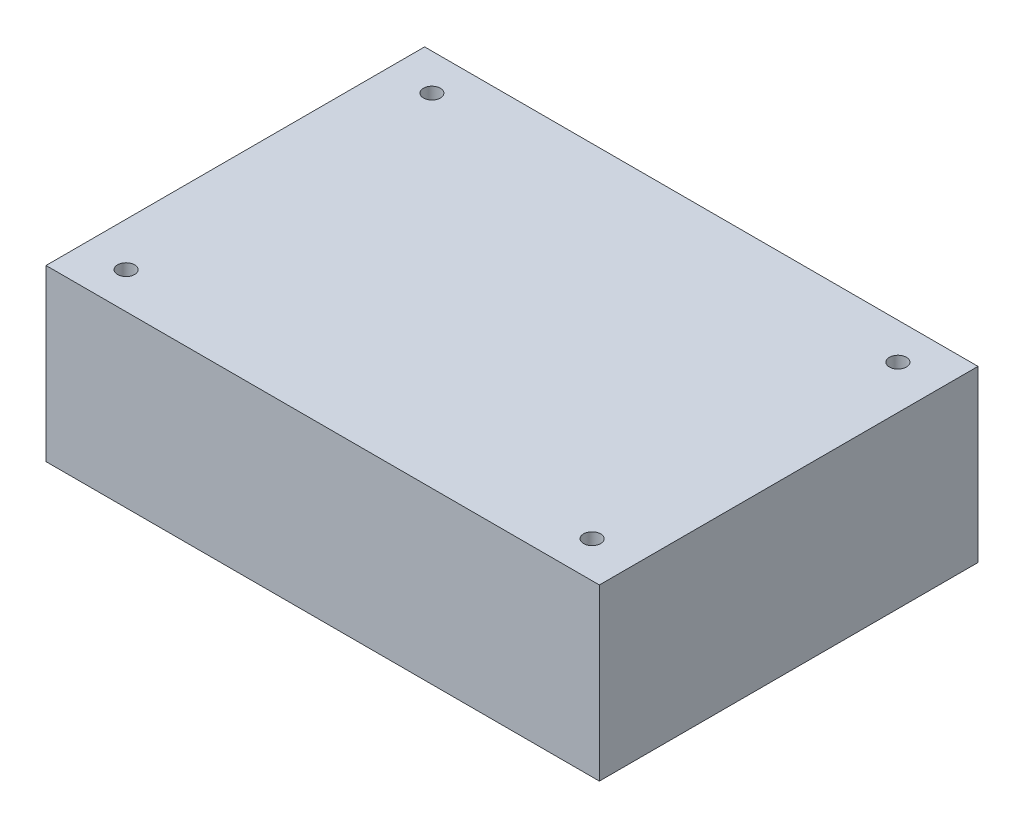
ISO-10303-21;
HEADER;
FILE_DESCRIPTION(('STEP AP214'),'2;1');
FILE_NAME('part.step','',(''),(''),'','','');
FILE_SCHEMA(('AUTOMOTIVE_DESIGN { 1 0 10303 214 1 1 1 1 }'));
ENDSEC;
DATA;
#1=APPLICATION_CONTEXT('core data for automotive mechanical design processes');
#2=APPLICATION_PROTOCOL_DEFINITION('international standard','automotive_design',2000,#1);
#3=PRODUCT_CONTEXT('',#1,'mechanical');
#4=PRODUCT('Part','Part','',(#3));
#5=PRODUCT_RELATED_PRODUCT_CATEGORY('part','',(#4));
#6=PRODUCT_DEFINITION_FORMATION('','',#4);
#7=PRODUCT_DEFINITION_CONTEXT('part definition',#1,'design');
#8=PRODUCT_DEFINITION('design','',#6,#7);
#9=PRODUCT_DEFINITION_SHAPE('','',#8);
#10=(LENGTH_UNIT() NAMED_UNIT(*) SI_UNIT(.MILLI.,.METRE.));
#11=(NAMED_UNIT(*) PLANE_ANGLE_UNIT() SI_UNIT($,.RADIAN.));
#12=(NAMED_UNIT(*) SI_UNIT($,.STERADIAN.) SOLID_ANGLE_UNIT());
#13=UNCERTAINTY_MEASURE_WITH_UNIT(LENGTH_MEASURE(1.E-05),#10,'distance_accuracy_value','');
#14=(GEOMETRIC_REPRESENTATION_CONTEXT(3) GLOBAL_UNCERTAINTY_ASSIGNED_CONTEXT((#13)) GLOBAL_UNIT_ASSIGNED_CONTEXT((#10,
#11,#12)) REPRESENTATION_CONTEXT('',''));
#15=CARTESIAN_POINT('',(0.,0.,0.));
#16=DIRECTION('',(0.,0.,1.));
#17=DIRECTION('',(1.,0.,0.));
#18=AXIS2_PLACEMENT_3D('',#15,#16,#17);
#19=CARTESIAN_POINT('',(0.,35.,0.));
#20=DIRECTION('',(0.,-1.,0.));
#21=DIRECTION('',(0.,0.,-1.));
#22=AXIS2_PLACEMENT_3D('',#19,#20,#21);
#23=PLANE('',#22);
#24=CARTESIAN_POINT('',(48.,35.,31.5));
#25=DIRECTION('',(0.,1.,0.));
#26=DIRECTION('',(0.,0.,1.));
#27=AXIS2_PLACEMENT_3D('',#24,#25,#26);
#28=CIRCLE('',#27,1.75);
#29=CARTESIAN_POINT('',(48.,35.,33.25));
#30=VERTEX_POINT('',#29);
#31=EDGE_CURVE('E123',#30,#30,#28,.T.);
#32=ORIENTED_EDGE('',*,*,#31,.F.);
#33=EDGE_LOOP('',(#32));
#34=FACE_BOUND('',#33,.T.);
#35=CARTESIAN_POINT('',(-48.,35.,-31.5));
#36=DIRECTION('',(0.,1.,0.));
#37=DIRECTION('',(0.,0.,1.));
#38=AXIS2_PLACEMENT_3D('',#35,#36,#37);
#39=CIRCLE('',#38,1.75);
#40=CARTESIAN_POINT('',(-48.,35.,-29.75));
#41=VERTEX_POINT('',#40);
#42=EDGE_CURVE('E102',#41,#41,#39,.T.);
#43=ORIENTED_EDGE('',*,*,#42,.F.);
#44=EDGE_LOOP('',(#43));
#45=FACE_BOUND('',#44,.T.);
#46=DIRECTION('',(0.,0.,-1.));
#47=VECTOR('',#46,1.);
#48=CARTESIAN_POINT('',(57.,35.,39.));
#49=LINE('',#48,#47);
#50=CARTESIAN_POINT('',(57.,35.,39.));
#51=VERTEX_POINT('',#50);
#52=CARTESIAN_POINT('',(57.,35.,-39.));
#53=VERTEX_POINT('',#52);
#54=EDGE_CURVE('E87',#51,#53,#49,.T.);
#55=ORIENTED_EDGE('',*,*,#54,.T.);
#56=DIRECTION('',(-1.,0.,0.));
#57=VECTOR('',#56,1.);
#58=CARTESIAN_POINT('',(-57.,35.,-39.));
#59=LINE('',#58,#57);
#60=CARTESIAN_POINT('',(-57.,35.,-39.));
#61=VERTEX_POINT('',#60);
#62=EDGE_CURVE('E82',#53,#61,#59,.T.);
#63=ORIENTED_EDGE('',*,*,#62,.T.);
#64=DIRECTION('',(0.,0.,1.));
#65=VECTOR('',#64,1.);
#66=CARTESIAN_POINT('',(-57.,35.,39.));
#67=LINE('',#66,#65);
#68=CARTESIAN_POINT('',(-57.,35.,39.));
#69=VERTEX_POINT('',#68);
#70=EDGE_CURVE('E85',#61,#69,#67,.T.);
#71=ORIENTED_EDGE('',*,*,#70,.T.);
#72=DIRECTION('',(1.,0.,0.));
#73=VECTOR('',#72,1.);
#74=CARTESIAN_POINT('',(-57.,35.,39.));
#75=LINE('',#74,#73);
#76=EDGE_CURVE('E52',#69,#51,#75,.T.);
#77=ORIENTED_EDGE('',*,*,#76,.T.);
#78=EDGE_LOOP('',(#55,#63,#71,#77));
#79=FACE_BOUND('',#78,.T.);
#80=CARTESIAN_POINT('',(-48.,35.,31.5));
#81=DIRECTION('',(0.,1.,0.));
#82=DIRECTION('',(0.,0.,1.));
#83=AXIS2_PLACEMENT_3D('',#80,#81,#82);
#84=CIRCLE('',#83,1.75);
#85=CARTESIAN_POINT('',(-48.,35.,33.25));
#86=VERTEX_POINT('',#85);
#87=EDGE_CURVE('E117',#86,#86,#84,.T.);
#88=ORIENTED_EDGE('',*,*,#87,.F.);
#89=EDGE_LOOP('',(#88));
#90=FACE_BOUND('',#89,.T.);
#91=CARTESIAN_POINT('',(48.,35.,-31.5));
#92=DIRECTION('',(0.,1.,0.));
#93=DIRECTION('',(0.,0.,1.));
#94=AXIS2_PLACEMENT_3D('',#91,#92,#93);
#95=CIRCLE('',#94,1.75);
#96=CARTESIAN_POINT('',(48.,35.,-29.75));
#97=VERTEX_POINT('',#96);
#98=EDGE_CURVE('E129',#97,#97,#95,.T.);
#99=ORIENTED_EDGE('',*,*,#98,.F.);
#100=EDGE_LOOP('',(#99));
#101=FACE_BOUND('',#100,.T.);
#102=ADVANCED_FACE('F35',(#34,#45,#79,#90,#101),#23,.F.);
#103=CARTESIAN_POINT('',(0.,0.,0.));
#104=DIRECTION('',(0.,-1.,0.));
#105=DIRECTION('',(0.,0.,-1.));
#106=AXIS2_PLACEMENT_3D('',#103,#104,#105);
#107=PLANE('',#106);
#108=CARTESIAN_POINT('',(48.,0.,31.5));
#109=DIRECTION('',(0.,1.,0.));
#110=DIRECTION('',(0.,0.,1.));
#111=AXIS2_PLACEMENT_3D('',#108,#109,#110);
#112=CIRCLE('',#111,1.75);
#113=CARTESIAN_POINT('',(48.,0.,33.25));
#114=VERTEX_POINT('',#113);
#115=EDGE_CURVE('E126',#114,#114,#112,.T.);
#116=ORIENTED_EDGE('',*,*,#115,.T.);
#117=EDGE_LOOP('',(#116));
#118=FACE_BOUND('',#117,.T.);
#119=CARTESIAN_POINT('',(-48.,0.,-31.5));
#120=DIRECTION('',(0.,1.,0.));
#121=DIRECTION('',(0.,0.,1.));
#122=AXIS2_PLACEMENT_3D('',#119,#120,#121);
#123=CIRCLE('',#122,1.75);
#124=CARTESIAN_POINT('',(-48.,0.,-29.75));
#125=VERTEX_POINT('',#124);
#126=EDGE_CURVE('E114',#125,#125,#123,.T.);
#127=ORIENTED_EDGE('',*,*,#126,.T.);
#128=EDGE_LOOP('',(#127));
#129=FACE_BOUND('',#128,.T.);
#130=DIRECTION('',(0.,0.,-1.));
#131=VECTOR('',#130,1.);
#132=CARTESIAN_POINT('',(57.,0.,39.));
#133=LINE('',#132,#131);
#134=CARTESIAN_POINT('',(57.,0.,39.));
#135=VERTEX_POINT('',#134);
#136=CARTESIAN_POINT('',(57.,0.,-39.));
#137=VERTEX_POINT('',#136);
#138=EDGE_CURVE('E99',#135,#137,#133,.T.);
#139=ORIENTED_EDGE('',*,*,#138,.F.);
#140=DIRECTION('',(1.,0.,0.));
#141=VECTOR('',#140,1.);
#142=CARTESIAN_POINT('',(-57.,0.,39.));
#143=LINE('',#142,#141);
#144=CARTESIAN_POINT('',(-57.,0.,39.));
#145=VERTEX_POINT('',#144);
#146=EDGE_CURVE('E75',#145,#135,#143,.T.);
#147=ORIENTED_EDGE('',*,*,#146,.F.);
#148=DIRECTION('',(0.,0.,1.));
#149=VECTOR('',#148,1.);
#150=CARTESIAN_POINT('',(-57.,0.,39.));
#151=LINE('',#150,#149);
#152=CARTESIAN_POINT('',(-57.,0.,-39.));
#153=VERTEX_POINT('',#152);
#154=EDGE_CURVE('E69',#153,#145,#151,.T.);
#155=ORIENTED_EDGE('',*,*,#154,.F.);
#156=DIRECTION('',(-1.,0.,0.));
#157=VECTOR('',#156,1.);
#158=CARTESIAN_POINT('',(-57.,0.,-39.));
#159=LINE('',#158,#157);
#160=EDGE_CURVE('E91',#137,#153,#159,.T.);
#161=ORIENTED_EDGE('',*,*,#160,.F.);
#162=EDGE_LOOP('',(#139,#147,#155,#161));
#163=FACE_BOUND('',#162,.T.);
#164=CARTESIAN_POINT('',(-48.,0.,31.5));
#165=DIRECTION('',(0.,1.,0.));
#166=DIRECTION('',(0.,0.,1.));
#167=AXIS2_PLACEMENT_3D('',#164,#165,#166);
#168=CIRCLE('',#167,1.75);
#169=CARTESIAN_POINT('',(-48.,0.,33.25));
#170=VERTEX_POINT('',#169);
#171=EDGE_CURVE('E120',#170,#170,#168,.T.);
#172=ORIENTED_EDGE('',*,*,#171,.T.);
#173=EDGE_LOOP('',(#172));
#174=FACE_BOUND('',#173,.T.);
#175=CARTESIAN_POINT('',(48.,0.,-31.5));
#176=DIRECTION('',(0.,1.,0.));
#177=DIRECTION('',(0.,0.,1.));
#178=AXIS2_PLACEMENT_3D('',#175,#176,#177);
#179=CIRCLE('',#178,1.75);
#180=CARTESIAN_POINT('',(48.,0.,-29.75));
#181=VERTEX_POINT('',#180);
#182=EDGE_CURVE('E132',#181,#181,#179,.T.);
#183=ORIENTED_EDGE('',*,*,#182,.T.);
#184=EDGE_LOOP('',(#183));
#185=FACE_BOUND('',#184,.T.);
#186=ADVANCED_FACE('F110',(#118,#129,#163,#174,#185),#107,.T.);
#187=CARTESIAN_POINT('',(57.,35.,39.));
#188=DIRECTION('',(-1.,0.,0.));
#189=DIRECTION('',(0.,0.,1.));
#190=AXIS2_PLACEMENT_3D('',#187,#188,#189);
#191=PLANE('',#190);
#192=ORIENTED_EDGE('',*,*,#138,.T.);
#193=DIRECTION('',(0.,-1.,0.));
#194=VECTOR('',#193,1.);
#195=CARTESIAN_POINT('',(57.,35.,-39.));
#196=LINE('',#195,#194);
#197=EDGE_CURVE('E11',#53,#137,#196,.T.);
#198=ORIENTED_EDGE('',*,*,#197,.F.);
#199=ORIENTED_EDGE('',*,*,#54,.F.);
#200=DIRECTION('',(0.,-1.,0.));
#201=VECTOR('',#200,1.);
#202=CARTESIAN_POINT('',(57.,35.,39.));
#203=LINE('',#202,#201);
#204=EDGE_CURVE('E95',#51,#135,#203,.T.);
#205=ORIENTED_EDGE('',*,*,#204,.T.);
#206=EDGE_LOOP('',(#192,#198,#199,#205));
#207=FACE_BOUND('',#206,.T.);
#208=ADVANCED_FACE('F37',(#207),#191,.F.);
#209=CARTESIAN_POINT('',(-57.,35.,-39.));
#210=DIRECTION('',(0.,0.,1.));
#211=DIRECTION('',(1.,0.,0.));
#212=AXIS2_PLACEMENT_3D('',#209,#210,#211);
#213=PLANE('',#212);
#214=ORIENTED_EDGE('',*,*,#160,.T.);
#215=DIRECTION('',(0.,-1.,0.));
#216=VECTOR('',#215,1.);
#217=CARTESIAN_POINT('',(-57.,35.,-39.));
#218=LINE('',#217,#216);
#219=EDGE_CURVE('E44',#61,#153,#218,.T.);
#220=ORIENTED_EDGE('',*,*,#219,.F.);
#221=ORIENTED_EDGE('',*,*,#62,.F.);
#222=ORIENTED_EDGE('',*,*,#197,.T.);
#223=EDGE_LOOP('',(#214,#220,#221,#222));
#224=FACE_BOUND('',#223,.T.);
#225=ADVANCED_FACE('F90',(#224),#213,.F.);
#226=CARTESIAN_POINT('',(-57.,35.,39.));
#227=DIRECTION('',(1.,0.,0.));
#228=DIRECTION('',(0.,0.,-1.));
#229=AXIS2_PLACEMENT_3D('',#226,#227,#228);
#230=PLANE('',#229);
#231=ORIENTED_EDGE('',*,*,#154,.T.);
#232=DIRECTION('',(0.,-1.,0.));
#233=VECTOR('',#232,1.);
#234=CARTESIAN_POINT('',(-57.,35.,39.));
#235=LINE('',#234,#233);
#236=EDGE_CURVE('E92',#69,#145,#235,.T.);
#237=ORIENTED_EDGE('',*,*,#236,.F.);
#238=ORIENTED_EDGE('',*,*,#70,.F.);
#239=ORIENTED_EDGE('',*,*,#219,.T.);
#240=EDGE_LOOP('',(#231,#237,#238,#239));
#241=FACE_BOUND('',#240,.T.);
#242=ADVANCED_FACE('F93',(#241),#230,.F.);
#243=CARTESIAN_POINT('',(-57.,35.,39.));
#244=DIRECTION('',(0.,0.,-1.));
#245=DIRECTION('',(-1.,0.,0.));
#246=AXIS2_PLACEMENT_3D('',#243,#244,#245);
#247=PLANE('',#246);
#248=ORIENTED_EDGE('',*,*,#146,.T.);
#249=ORIENTED_EDGE('',*,*,#204,.F.);
#250=ORIENTED_EDGE('',*,*,#76,.F.);
#251=ORIENTED_EDGE('',*,*,#236,.T.);
#252=EDGE_LOOP('',(#248,#249,#250,#251));
#253=FACE_BOUND('',#252,.T.);
#254=ADVANCED_FACE('F107',(#253),#247,.F.);
#255=CARTESIAN_POINT('',(-48.,35.,-31.5));
#256=DIRECTION('',(0.,-1.,0.));
#257=DIRECTION('',(0.,0.,-1.));
#258=AXIS2_PLACEMENT_3D('',#255,#256,#257);
#259=CYLINDRICAL_SURFACE('',#258,1.75);
#260=ORIENTED_EDGE('',*,*,#42,.T.);
#261=EDGE_LOOP('',(#260));
#262=FACE_BOUND('',#261,.T.);
#263=ORIENTED_EDGE('',*,*,#126,.F.);
#264=EDGE_LOOP('',(#263));
#265=FACE_BOUND('',#264,.T.);
#266=ADVANCED_FACE('F152',(#262,#265),#259,.F.);
#267=CARTESIAN_POINT('',(-48.,35.,31.5));
#268=DIRECTION('',(0.,-1.,0.));
#269=DIRECTION('',(0.,0.,-1.));
#270=AXIS2_PLACEMENT_3D('',#267,#268,#269);
#271=CYLINDRICAL_SURFACE('',#270,1.75);
#272=ORIENTED_EDGE('',*,*,#87,.T.);
#273=EDGE_LOOP('',(#272));
#274=FACE_BOUND('',#273,.T.);
#275=ORIENTED_EDGE('',*,*,#171,.F.);
#276=EDGE_LOOP('',(#275));
#277=FACE_BOUND('',#276,.T.);
#278=ADVANCED_FACE('F198',(#274,#277),#271,.F.);
#279=CARTESIAN_POINT('',(48.,35.,31.5));
#280=DIRECTION('',(0.,-1.,0.));
#281=DIRECTION('',(0.,0.,-1.));
#282=AXIS2_PLACEMENT_3D('',#279,#280,#281);
#283=CYLINDRICAL_SURFACE('',#282,1.75);
#284=ORIENTED_EDGE('',*,*,#31,.T.);
#285=EDGE_LOOP('',(#284));
#286=FACE_BOUND('',#285,.T.);
#287=ORIENTED_EDGE('',*,*,#115,.F.);
#288=EDGE_LOOP('',(#287));
#289=FACE_BOUND('',#288,.T.);
#290=ADVANCED_FACE('F206',(#286,#289),#283,.F.);
#291=CARTESIAN_POINT('',(48.,35.,-31.5));
#292=DIRECTION('',(0.,-1.,0.));
#293=DIRECTION('',(0.,0.,-1.));
#294=AXIS2_PLACEMENT_3D('',#291,#292,#293);
#295=CYLINDRICAL_SURFACE('',#294,1.75);
#296=ORIENTED_EDGE('',*,*,#98,.T.);
#297=EDGE_LOOP('',(#296));
#298=FACE_BOUND('',#297,.T.);
#299=ORIENTED_EDGE('',*,*,#182,.F.);
#300=EDGE_LOOP('',(#299));
#301=FACE_BOUND('',#300,.T.);
#302=ADVANCED_FACE('F138',(#298,#301),#295,.F.);
#303=CLOSED_SHELL('',(#102,#186,#208,#225,#242,#254,#266,#278,#290,#302));
#304=MANIFOLD_SOLID_BREP('B2',#303);
#305=ADVANCED_BREP_SHAPE_REPRESENTATION('',(#18,#304),#14);
#306=SHAPE_DEFINITION_REPRESENTATION(#9,#305);
ENDSEC;
END-ISO-10303-21;
